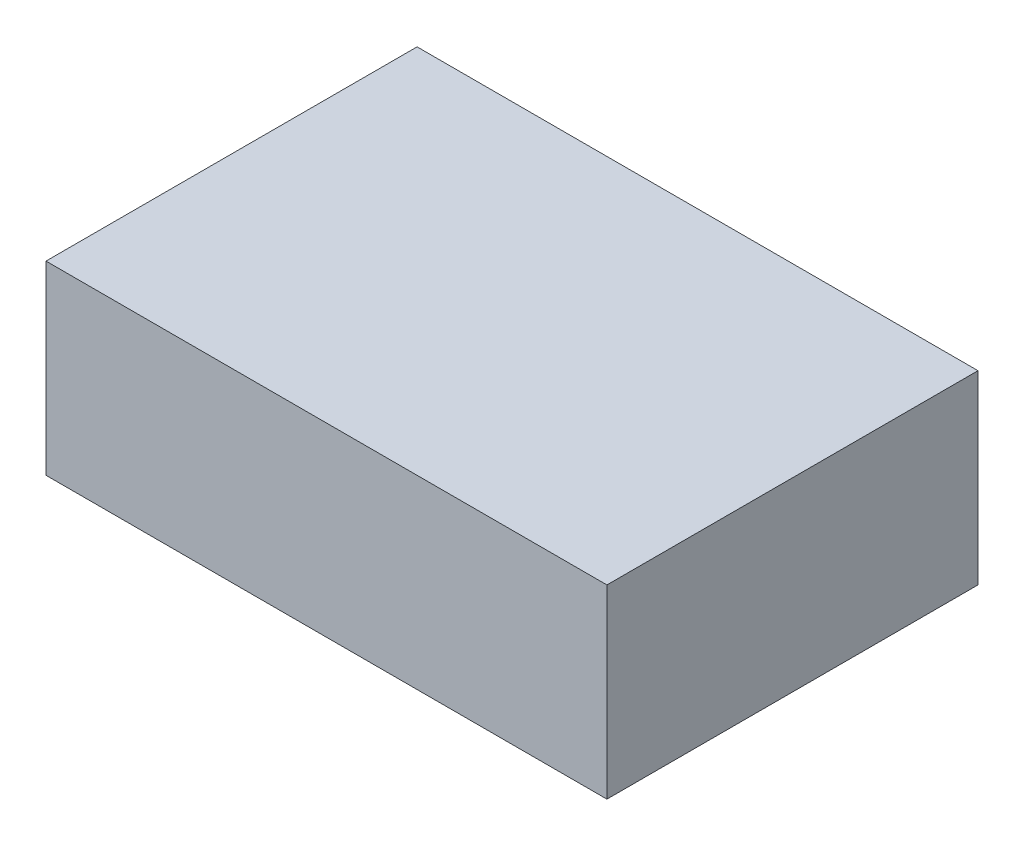
ISO-10303-21;
HEADER;
FILE_DESCRIPTION(('STEP AP214'),'2;1');
FILE_NAME('part.step','',(''),(''),'','','');
FILE_SCHEMA(('AUTOMOTIVE_DESIGN { 1 0 10303 214 1 1 1 1 }'));
ENDSEC;
DATA;
#1=APPLICATION_CONTEXT('core data for automotive mechanical design processes');
#2=APPLICATION_PROTOCOL_DEFINITION('international standard','automotive_design',2000,#1);
#3=PRODUCT_CONTEXT('',#1,'mechanical');
#4=PRODUCT('Part','Part','',(#3));
#5=PRODUCT_RELATED_PRODUCT_CATEGORY('part','',(#4));
#6=PRODUCT_DEFINITION_FORMATION('','',#4);
#7=PRODUCT_DEFINITION_CONTEXT('part definition',#1,'design');
#8=PRODUCT_DEFINITION('design','',#6,#7);
#9=PRODUCT_DEFINITION_SHAPE('','',#8);
#10=(LENGTH_UNIT() NAMED_UNIT(*) SI_UNIT(.MILLI.,.METRE.));
#11=(NAMED_UNIT(*) PLANE_ANGLE_UNIT() SI_UNIT($,.RADIAN.));
#12=(NAMED_UNIT(*) SI_UNIT($,.STERADIAN.) SOLID_ANGLE_UNIT());
#13=UNCERTAINTY_MEASURE_WITH_UNIT(LENGTH_MEASURE(1.E-05),#10,'distance_accuracy_value','');
#14=(GEOMETRIC_REPRESENTATION_CONTEXT(3) GLOBAL_UNCERTAINTY_ASSIGNED_CONTEXT((#13)) GLOBAL_UNIT_ASSIGNED_CONTEXT((#10,
#11,#12)) REPRESENTATION_CONTEXT('',''));
#15=CARTESIAN_POINT('',(0.,0.,0.));
#16=DIRECTION('',(0.,0.,1.));
#17=DIRECTION('',(1.,0.,0.));
#18=AXIS2_PLACEMENT_3D('',#15,#16,#17);
#19=CARTESIAN_POINT('',(65.000000048,-21.500000053,42.999999979));
#20=DIRECTION('',(-1.,0.,0.));
#21=DIRECTION('',(0.,0.,1.));
#22=AXIS2_PLACEMENT_3D('',#19,#20,#21);
#23=PLANE('',#22);
#24=DIRECTION('',(0.,1.,0.));
#25=VECTOR('',#24,1.);
#26=CARTESIAN_POINT('',(65.000000048,-21.500000053,-42.999999979));
#27=LINE('',#26,#25);
#28=CARTESIAN_POINT('',(65.000000048,-21.500000053,-42.999999979));
#29=VERTEX_POINT('',#28);
#30=CARTESIAN_POINT('',(65.000000048,21.500000053,-42.999999979));
#31=VERTEX_POINT('',#30);
#32=EDGE_CURVE('E132',#29,#31,#27,.T.);
#33=ORIENTED_EDGE('',*,*,#32,.T.);
#34=DIRECTION('',(0.,0.,-1.));
#35=VECTOR('',#34,1.);
#36=CARTESIAN_POINT('',(65.000000048,21.500000053,42.999999979));
#37=LINE('',#36,#35);
#38=CARTESIAN_POINT('',(65.000000048,21.500000053,42.999999979));
#39=VERTEX_POINT('',#38);
#40=EDGE_CURVE('E11',#39,#31,#37,.T.);
#41=ORIENTED_EDGE('',*,*,#40,.F.);
#42=DIRECTION('',(0.,1.,0.));
#43=VECTOR('',#42,1.);
#44=CARTESIAN_POINT('',(65.000000048,-21.500000053,42.999999979));
#45=LINE('',#44,#43);
#46=CARTESIAN_POINT('',(65.000000048,-21.500000053,42.999999979));
#47=VERTEX_POINT('',#46);
#48=EDGE_CURVE('E133',#47,#39,#45,.T.);
#49=ORIENTED_EDGE('',*,*,#48,.F.);
#50=DIRECTION('',(0.,0.,-1.));
#51=VECTOR('',#50,1.);
#52=CARTESIAN_POINT('',(65.000000048,-21.500000053,42.999999979));
#53=LINE('',#52,#51);
#54=EDGE_CURVE('E139',#47,#29,#53,.T.);
#55=ORIENTED_EDGE('',*,*,#54,.T.);
#56=EDGE_LOOP('',(#33,#41,#49,#55));
#57=FACE_BOUND('',#56,.T.);
#58=ADVANCED_FACE('F37',(#57),#23,.F.);
#59=CARTESIAN_POINT('',(-65.000000048,21.500000053,42.999999979));
#60=DIRECTION('',(0.,-1.,0.));
#61=DIRECTION('',(0.,0.,-1.));
#62=AXIS2_PLACEMENT_3D('',#59,#60,#61);
#63=PLANE('',#62);
#64=DIRECTION('',(-1.,0.,0.));
#65=VECTOR('',#64,1.);
#66=CARTESIAN_POINT('',(-65.000000048,21.500000053,-42.999999979));
#67=LINE('',#66,#65);
#68=CARTESIAN_POINT('',(-65.000000048,21.500000053,-42.999999979));
#69=VERTEX_POINT('',#68);
#70=EDGE_CURVE('E142',#31,#69,#67,.T.);
#71=ORIENTED_EDGE('',*,*,#70,.T.);
#72=DIRECTION('',(0.,0.,-1.));
#73=VECTOR('',#72,1.);
#74=CARTESIAN_POINT('',(-65.000000048,21.500000053,42.999999979));
#75=LINE('',#74,#73);
#76=CARTESIAN_POINT('',(-65.000000048,21.500000053,42.999999979));
#77=VERTEX_POINT('',#76);
#78=EDGE_CURVE('E45',#77,#69,#75,.T.);
#79=ORIENTED_EDGE('',*,*,#78,.F.);
#80=DIRECTION('',(-1.,0.,0.));
#81=VECTOR('',#80,1.);
#82=CARTESIAN_POINT('',(-65.000000048,21.500000053,42.999999979));
#83=LINE('',#82,#81);
#84=EDGE_CURVE('E84',#39,#77,#83,.T.);
#85=ORIENTED_EDGE('',*,*,#84,.F.);
#86=ORIENTED_EDGE('',*,*,#40,.T.);
#87=EDGE_LOOP('',(#71,#79,#85,#86));
#88=FACE_BOUND('',#87,.T.);
#89=ADVANCED_FACE('F166',(#88),#63,.F.);
#90=CARTESIAN_POINT('',(-65.000000048,-21.500000053,42.999999979));
#91=DIRECTION('',(1.,0.,0.));
#92=DIRECTION('',(0.,0.,-1.));
#93=AXIS2_PLACEMENT_3D('',#90,#91,#92);
#94=PLANE('',#93);
#95=DIRECTION('',(0.,-1.,0.));
#96=VECTOR('',#95,1.);
#97=CARTESIAN_POINT('',(-65.000000048,-21.500000053,-42.999999979));
#98=LINE('',#97,#96);
#99=CARTESIAN_POINT('',(-65.000000048,-21.500000053,-42.999999979));
#100=VERTEX_POINT('',#99);
#101=EDGE_CURVE('E71',#69,#100,#98,.T.);
#102=ORIENTED_EDGE('',*,*,#101,.T.);
#103=DIRECTION('',(0.,0.,-1.));
#104=VECTOR('',#103,1.);
#105=CARTESIAN_POINT('',(-65.000000048,-21.500000053,42.999999979));
#106=LINE('',#105,#104);
#107=CARTESIAN_POINT('',(-65.000000048,-21.500000053,42.999999979));
#108=VERTEX_POINT('',#107);
#109=EDGE_CURVE('E147',#108,#100,#106,.T.);
#110=ORIENTED_EDGE('',*,*,#109,.F.);
#111=DIRECTION('',(0.,-1.,0.));
#112=VECTOR('',#111,1.);
#113=CARTESIAN_POINT('',(-65.000000048,-21.500000053,42.999999979));
#114=LINE('',#113,#112);
#115=EDGE_CURVE('E136',#77,#108,#114,.T.);
#116=ORIENTED_EDGE('',*,*,#115,.F.);
#117=ORIENTED_EDGE('',*,*,#78,.T.);
#118=EDGE_LOOP('',(#102,#110,#116,#117));
#119=FACE_BOUND('',#118,.T.);
#120=ADVANCED_FACE('F149',(#119),#94,.F.);
#121=CARTESIAN_POINT('',(-65.000000048,-21.500000053,42.999999979));
#122=DIRECTION('',(0.,1.,0.));
#123=DIRECTION('',(0.,0.,1.));
#124=AXIS2_PLACEMENT_3D('',#121,#122,#123);
#125=PLANE('',#124);
#126=CARTESIAN_POINT('',(-60.000000142,-21.500000053,24.700000003));
#127=DIRECTION('',(0.,-1.,0.));
#128=DIRECTION('',(0.,0.,-1.));
#129=AXIS2_PLACEMENT_3D('',#126,#127,#128);
#130=CIRCLE('',#129,1.25);
#131=CARTESIAN_POINT('',(-60.000000142,-21.500000053,23.450000003));
#132=VERTEX_POINT('',#131);
#133=EDGE_CURVE('E108',#132,#132,#130,.T.);
#134=ORIENTED_EDGE('',*,*,#133,.F.);
#135=EDGE_LOOP('',(#134));
#136=FACE_BOUND('',#135,.T.);
#137=CARTESIAN_POINT('',(60.000000142,-21.500000053,24.700000003));
#138=DIRECTION('',(0.,-1.,0.));
#139=DIRECTION('',(0.,0.,-1.));
#140=AXIS2_PLACEMENT_3D('',#137,#138,#139);
#141=CIRCLE('',#140,1.25);
#142=CARTESIAN_POINT('',(60.000000142,-21.500000053,23.450000003));
#143=VERTEX_POINT('',#142);
#144=EDGE_CURVE('E107',#143,#143,#141,.T.);
#145=ORIENTED_EDGE('',*,*,#144,.F.);
#146=EDGE_LOOP('',(#145));
#147=FACE_BOUND('',#146,.T.);
#148=CARTESIAN_POINT('',(60.000000142,-21.500000053,-25.300000073));
#149=DIRECTION('',(0.,-1.,0.));
#150=DIRECTION('',(0.,0.,-1.));
#151=AXIS2_PLACEMENT_3D('',#148,#149,#150);
#152=CIRCLE('',#151,1.25);
#153=CARTESIAN_POINT('',(60.000000142,-21.500000053,-26.550000073));
#154=VERTEX_POINT('',#153);
#155=EDGE_CURVE('E120',#154,#154,#152,.T.);
#156=ORIENTED_EDGE('',*,*,#155,.F.);
#157=EDGE_LOOP('',(#156));
#158=FACE_BOUND('',#157,.T.);
#159=CARTESIAN_POINT('',(-60.000000142,-21.500000053,-25.300000073));
#160=DIRECTION('',(0.,-1.,0.));
#161=DIRECTION('',(0.,0.,-1.));
#162=AXIS2_PLACEMENT_3D('',#159,#160,#161);
#163=CIRCLE('',#162,1.25);
#164=CARTESIAN_POINT('',(-60.000000142,-21.500000053,-26.550000073));
#165=VERTEX_POINT('',#164);
#166=EDGE_CURVE('E126',#165,#165,#163,.T.);
#167=ORIENTED_EDGE('',*,*,#166,.F.);
#168=EDGE_LOOP('',(#167));
#169=FACE_BOUND('',#168,.T.);
#170=DIRECTION('',(1.,0.,0.));
#171=VECTOR('',#170,1.);
#172=CARTESIAN_POINT('',(-65.000000048,-21.500000053,-42.999999979));
#173=LINE('',#172,#171);
#174=EDGE_CURVE('E77',#100,#29,#173,.T.);
#175=ORIENTED_EDGE('',*,*,#174,.T.);
#176=ORIENTED_EDGE('',*,*,#54,.F.);
#177=DIRECTION('',(1.,0.,0.));
#178=VECTOR('',#177,1.);
#179=CARTESIAN_POINT('',(-65.000000048,-21.500000053,42.999999979));
#180=LINE('',#179,#178);
#181=EDGE_CURVE('E53',#108,#47,#180,.T.);
#182=ORIENTED_EDGE('',*,*,#181,.F.);
#183=ORIENTED_EDGE('',*,*,#109,.T.);
#184=EDGE_LOOP('',(#175,#176,#182,#183));
#185=FACE_BOUND('',#184,.T.);
#186=ADVANCED_FACE('F156',(#136,#147,#158,#169,#185),#125,.F.);
#187=CARTESIAN_POINT('',(0.,0.,42.999999979));
#188=DIRECTION('',(0.,0.,-1.));
#189=DIRECTION('',(-1.,0.,0.));
#190=AXIS2_PLACEMENT_3D('',#187,#188,#189);
#191=PLANE('',#190);
#192=ORIENTED_EDGE('',*,*,#48,.T.);
#193=ORIENTED_EDGE('',*,*,#84,.T.);
#194=ORIENTED_EDGE('',*,*,#115,.T.);
#195=ORIENTED_EDGE('',*,*,#181,.T.);
#196=EDGE_LOOP('',(#192,#193,#194,#195));
#197=FACE_BOUND('',#196,.T.);
#198=ADVANCED_FACE('F158',(#197),#191,.F.);
#199=CARTESIAN_POINT('',(0.,0.,-42.999999979));
#200=DIRECTION('',(0.,0.,-1.));
#201=DIRECTION('',(-1.,0.,0.));
#202=AXIS2_PLACEMENT_3D('',#199,#200,#201);
#203=PLANE('',#202);
#204=CARTESIAN_POINT('',(0.,0.,-42.999999979));
#205=DIRECTION('',(0.,0.,-1.));
#206=DIRECTION('',(-1.,0.,0.));
#207=AXIS2_PLACEMENT_3D('',#204,#205,#206);
#208=CIRCLE('',#207,12.7);
#209=CARTESIAN_POINT('',(-12.7,0.,-42.999999979));
#210=VERTEX_POINT('',#209);
#211=EDGE_CURVE('E300',#210,#210,#208,.T.);
#212=ORIENTED_EDGE('',*,*,#211,.F.);
#213=EDGE_LOOP('',(#212));
#214=FACE_BOUND('',#213,.T.);
#215=ORIENTED_EDGE('',*,*,#32,.F.);
#216=ORIENTED_EDGE('',*,*,#174,.F.);
#217=ORIENTED_EDGE('',*,*,#101,.F.);
#218=ORIENTED_EDGE('',*,*,#70,.F.);
#219=EDGE_LOOP('',(#215,#216,#217,#218));
#220=FACE_BOUND('',#219,.T.);
#221=ADVANCED_FACE('F152',(#214,#220),#203,.T.);
#222=CARTESIAN_POINT('',(-60.000000142,-19.500004053,-25.300000073));
#223=DIRECTION('',(0.,-1.,0.));
#224=DIRECTION('',(0.,0.,-1.));
#225=AXIS2_PLACEMENT_3D('',#222,#223,#224);
#226=CONICAL_SURFACE('',#225,1.25,1.02974425867666);
#227=CARTESIAN_POINT('',(-60.000000142,-18.7489282792155,-25.300000073));
#228=VERTEX_POINT('',#227);
#229=VERTEX_LOOP('',#228);
#230=FACE_BOUND('',#229,.T.);
#231=CARTESIAN_POINT('',(-60.000000142,-19.500004053,-25.300000073));
#232=DIRECTION('',(0.,-1.,0.));
#233=DIRECTION('',(0.,0.,-1.));
#234=AXIS2_PLACEMENT_3D('',#231,#232,#233);
#235=CIRCLE('',#234,1.25);
#236=CARTESIAN_POINT('',(-60.000000142,-19.500004053,-26.550000073));
#237=VERTEX_POINT('',#236);
#238=EDGE_CURVE('E129',#237,#237,#235,.T.);
#239=ORIENTED_EDGE('',*,*,#238,.T.);
#240=EDGE_LOOP('',(#239));
#241=FACE_BOUND('',#240,.T.);
#242=ADVANCED_FACE('F198',(#230,#241),#226,.F.);
#243=CARTESIAN_POINT('',(-60.000000142,-21.500000053,-25.300000073));
#244=DIRECTION('',(0.,-1.,0.));
#245=DIRECTION('',(0.,0.,-1.));
#246=AXIS2_PLACEMENT_3D('',#243,#244,#245);
#247=CYLINDRICAL_SURFACE('',#246,1.25);
#248=ORIENTED_EDGE('',*,*,#238,.F.);
#249=EDGE_LOOP('',(#248));
#250=FACE_BOUND('',#249,.T.);
#251=ORIENTED_EDGE('',*,*,#166,.T.);
#252=EDGE_LOOP('',(#251));
#253=FACE_BOUND('',#252,.T.);
#254=ADVANCED_FACE('F203',(#250,#253),#247,.F.);
#255=CARTESIAN_POINT('',(60.000000142,-19.500004053,-25.300000073));
#256=DIRECTION('',(0.,-1.,0.));
#257=DIRECTION('',(0.,0.,-1.));
#258=AXIS2_PLACEMENT_3D('',#255,#256,#257);
#259=CONICAL_SURFACE('',#258,1.25,1.02974425867666);
#260=CARTESIAN_POINT('',(60.000000142,-18.7489282792155,-25.300000073));
#261=VERTEX_POINT('',#260);
#262=VERTEX_LOOP('',#261);
#263=FACE_BOUND('',#262,.T.);
#264=CARTESIAN_POINT('',(60.000000142,-19.500004053,-25.300000073));
#265=DIRECTION('',(0.,-1.,0.));
#266=DIRECTION('',(0.,0.,-1.));
#267=AXIS2_PLACEMENT_3D('',#264,#265,#266);
#268=CIRCLE('',#267,1.25);
#269=CARTESIAN_POINT('',(60.000000142,-19.500004053,-26.550000073));
#270=VERTEX_POINT('',#269);
#271=EDGE_CURVE('E123',#270,#270,#268,.T.);
#272=ORIENTED_EDGE('',*,*,#271,.T.);
#273=EDGE_LOOP('',(#272));
#274=FACE_BOUND('',#273,.T.);
#275=ADVANCED_FACE('F214',(#263,#274),#259,.F.);
#276=CARTESIAN_POINT('',(60.000000142,-21.500000053,-25.300000073));
#277=DIRECTION('',(0.,-1.,0.));
#278=DIRECTION('',(0.,0.,-1.));
#279=AXIS2_PLACEMENT_3D('',#276,#277,#278);
#280=CYLINDRICAL_SURFACE('',#279,1.25);
#281=ORIENTED_EDGE('',*,*,#271,.F.);
#282=EDGE_LOOP('',(#281));
#283=FACE_BOUND('',#282,.T.);
#284=ORIENTED_EDGE('',*,*,#155,.T.);
#285=EDGE_LOOP('',(#284));
#286=FACE_BOUND('',#285,.T.);
#287=ADVANCED_FACE('F225',(#283,#286),#280,.F.);
#288=CARTESIAN_POINT('',(60.000000142,-19.500004053,24.700000003));
#289=DIRECTION('',(0.,-1.,0.));
#290=DIRECTION('',(0.,0.,-1.));
#291=AXIS2_PLACEMENT_3D('',#288,#289,#290);
#292=CONICAL_SURFACE('',#291,1.25,1.02974425867666);
#293=CARTESIAN_POINT('',(60.000000142,-18.7489282792155,24.700000003));
#294=VERTEX_POINT('',#293);
#295=VERTEX_LOOP('',#294);
#296=FACE_BOUND('',#295,.T.);
#297=CARTESIAN_POINT('',(60.000000142,-19.500004053,24.700000003));
#298=DIRECTION('',(0.,-1.,0.));
#299=DIRECTION('',(0.,0.,-1.));
#300=AXIS2_PLACEMENT_3D('',#297,#298,#299);
#301=CIRCLE('',#300,1.25);
#302=CARTESIAN_POINT('',(60.000000142,-19.500004053,23.450000003));
#303=VERTEX_POINT('',#302);
#304=EDGE_CURVE('E111',#303,#303,#301,.T.);
#305=ORIENTED_EDGE('',*,*,#304,.T.);
#306=EDGE_LOOP('',(#305));
#307=FACE_BOUND('',#306,.T.);
#308=ADVANCED_FACE('F235',(#296,#307),#292,.F.);
#309=CARTESIAN_POINT('',(60.000000142,-21.500000053,24.700000003));
#310=DIRECTION('',(0.,-1.,0.));
#311=DIRECTION('',(0.,0.,-1.));
#312=AXIS2_PLACEMENT_3D('',#309,#310,#311);
#313=CYLINDRICAL_SURFACE('',#312,1.25);
#314=ORIENTED_EDGE('',*,*,#304,.F.);
#315=EDGE_LOOP('',(#314));
#316=FACE_BOUND('',#315,.T.);
#317=ORIENTED_EDGE('',*,*,#144,.T.);
#318=EDGE_LOOP('',(#317));
#319=FACE_BOUND('',#318,.T.);
#320=ADVANCED_FACE('F101',(#316,#319),#313,.F.);
#321=CARTESIAN_POINT('',(-60.000000142,-19.500004053,24.700000003));
#322=DIRECTION('',(0.,-1.,0.));
#323=DIRECTION('',(0.,0.,-1.));
#324=AXIS2_PLACEMENT_3D('',#321,#322,#323);
#325=CONICAL_SURFACE('',#324,1.25,1.02974425867666);
#326=CARTESIAN_POINT('',(-60.000000142,-18.7489282792155,24.700000003));
#327=VERTEX_POINT('',#326);
#328=VERTEX_LOOP('',#327);
#329=FACE_BOUND('',#328,.T.);
#330=CARTESIAN_POINT('',(-60.000000142,-19.500004053,24.700000003));
#331=DIRECTION('',(0.,-1.,0.));
#332=DIRECTION('',(0.,0.,-1.));
#333=AXIS2_PLACEMENT_3D('',#330,#331,#332);
#334=CIRCLE('',#333,1.25);
#335=CARTESIAN_POINT('',(-60.000000142,-19.500004053,23.450000003));
#336=VERTEX_POINT('',#335);
#337=EDGE_CURVE('E105',#336,#336,#334,.T.);
#338=ORIENTED_EDGE('',*,*,#337,.T.);
#339=EDGE_LOOP('',(#338));
#340=FACE_BOUND('',#339,.T.);
#341=ADVANCED_FACE('F97',(#329,#340),#325,.F.);
#342=CARTESIAN_POINT('',(-60.000000142,-21.500000053,24.700000003));
#343=DIRECTION('',(0.,-1.,0.));
#344=DIRECTION('',(0.,0.,-1.));
#345=AXIS2_PLACEMENT_3D('',#342,#343,#344);
#346=CYLINDRICAL_SURFACE('',#345,1.25);
#347=ORIENTED_EDGE('',*,*,#337,.F.);
#348=EDGE_LOOP('',(#347));
#349=FACE_BOUND('',#348,.T.);
#350=ORIENTED_EDGE('',*,*,#133,.T.);
#351=EDGE_LOOP('',(#350));
#352=FACE_BOUND('',#351,.T.);
#353=ADVANCED_FACE('F100',(#349,#352),#346,.F.);
#354=CARTESIAN_POINT('',(0.,0.,-40.459999979));
#355=DIRECTION('',(0.,0.,-1.));
#356=DIRECTION('',(-1.,0.,0.));
#357=AXIS2_PLACEMENT_3D('',#354,#355,#356);
#358=CYLINDRICAL_SURFACE('',#357,12.7);
#359=CARTESIAN_POINT('',(0.,0.,-40.459999979));
#360=DIRECTION('',(0.,0.,-1.));
#361=DIRECTION('',(-1.,0.,0.));
#362=AXIS2_PLACEMENT_3D('',#359,#360,#361);
#363=CIRCLE('',#362,12.7);
#364=CARTESIAN_POINT('',(-12.7,0.,-40.459999979));
#365=VERTEX_POINT('',#364);
#366=EDGE_CURVE('E114',#365,#365,#363,.T.);
#367=ORIENTED_EDGE('',*,*,#366,.F.);
#368=EDGE_LOOP('',(#367));
#369=FACE_BOUND('',#368,.T.);
#370=ORIENTED_EDGE('',*,*,#211,.T.);
#371=EDGE_LOOP('',(#370));
#372=FACE_BOUND('',#371,.T.);
#373=ADVANCED_FACE('F271',(#369,#372),#358,.F.);
#374=CARTESIAN_POINT('',(0.,0.,-40.459999979));
#375=DIRECTION('',(0.,0.,-1.));
#376=DIRECTION('',(-1.,0.,0.));
#377=AXIS2_PLACEMENT_3D('',#374,#375,#376);
#378=PLANE('',#377);
#379=ORIENTED_EDGE('',*,*,#366,.T.);
#380=EDGE_LOOP('',(#379));
#381=FACE_BOUND('',#380,.T.);
#382=ADVANCED_FACE('F284',(#381),#378,.T.);
#383=CLOSED_SHELL('',(#58,#89,#120,#186,#198,#221,#242,#254,#275,#287,#308,#320,#341,#353,#373,#382));
#384=MANIFOLD_SOLID_BREP('B2',#383);
#385=ADVANCED_BREP_SHAPE_REPRESENTATION('',(#18,#384),#14);
#386=SHAPE_DEFINITION_REPRESENTATION(#9,#385);
ENDSEC;
END-ISO-10303-21;
